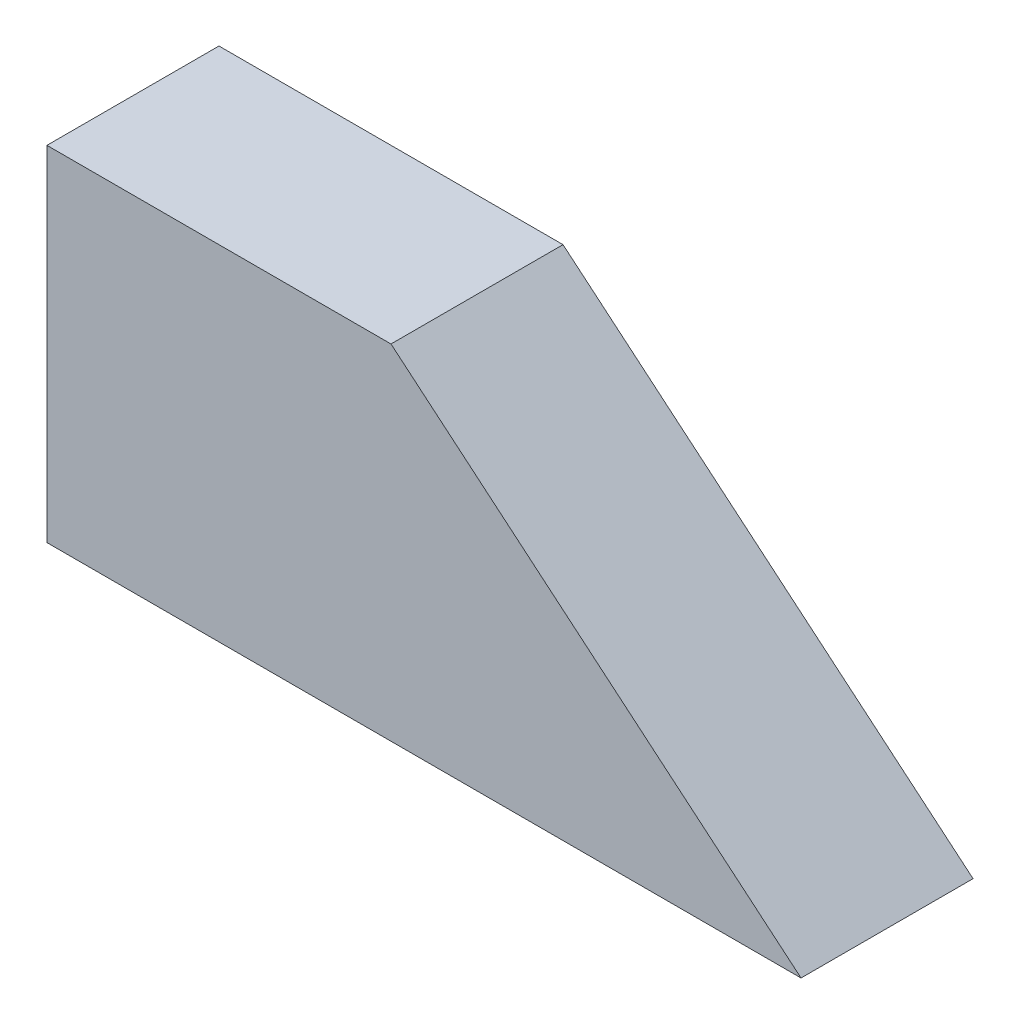
ISO-10303-21;
HEADER;
FILE_DESCRIPTION(('STEP AP214'),'2;1');
FILE_NAME('part.step','',(''),(''),'','','');
FILE_SCHEMA(('AUTOMOTIVE_DESIGN { 1 0 10303 214 1 1 1 1 }'));
ENDSEC;
DATA;
#1=APPLICATION_CONTEXT('core data for automotive mechanical design processes');
#2=APPLICATION_PROTOCOL_DEFINITION('international standard','automotive_design',2000,#1);
#3=PRODUCT_CONTEXT('',#1,'mechanical');
#4=PRODUCT('Part','Part','',(#3));
#5=PRODUCT_RELATED_PRODUCT_CATEGORY('part','',(#4));
#6=PRODUCT_DEFINITION_FORMATION('','',#4);
#7=PRODUCT_DEFINITION_CONTEXT('part definition',#1,'design');
#8=PRODUCT_DEFINITION('design','',#6,#7);
#9=PRODUCT_DEFINITION_SHAPE('','',#8);
#10=(LENGTH_UNIT() NAMED_UNIT(*) SI_UNIT(.MILLI.,.METRE.));
#11=(NAMED_UNIT(*) PLANE_ANGLE_UNIT() SI_UNIT($,.RADIAN.));
#12=(NAMED_UNIT(*) SI_UNIT($,.STERADIAN.) SOLID_ANGLE_UNIT());
#13=UNCERTAINTY_MEASURE_WITH_UNIT(LENGTH_MEASURE(1.E-05),#10,'distance_accuracy_value','');
#14=(GEOMETRIC_REPRESENTATION_CONTEXT(3) GLOBAL_UNCERTAINTY_ASSIGNED_CONTEXT((#13)) GLOBAL_UNIT_ASSIGNED_CONTEXT((#10,
#11,#12)) REPRESENTATION_CONTEXT('',''));
#15=CARTESIAN_POINT('',(0.,0.,0.));
#16=DIRECTION('',(0.,0.,1.));
#17=DIRECTION('',(1.,0.,0.));
#18=AXIS2_PLACEMENT_3D('',#15,#16,#17);
#19=CARTESIAN_POINT('',(0.,0.,500.));
#20=DIRECTION('',(1.,0.,0.));
#21=DIRECTION('',(0.,0.,-1.));
#22=AXIS2_PLACEMENT_3D('',#19,#20,#21);
#23=PLANE('',#22);
#24=DIRECTION('',(0.,-1.,0.));
#25=VECTOR('',#24,1.);
#26=CARTESIAN_POINT('',(0.,0.,0.));
#27=LINE('',#26,#25);
#28=CARTESIAN_POINT('',(0.,1000.,0.));
#29=VERTEX_POINT('',#28);
#30=CARTESIAN_POINT('',(0.,0.,0.));
#31=VERTEX_POINT('',#30);
#32=EDGE_CURVE('E113',#29,#31,#27,.T.);
#33=ORIENTED_EDGE('',*,*,#32,.T.);
#34=DIRECTION('',(0.,0.,-1.));
#35=VECTOR('',#34,1.);
#36=CARTESIAN_POINT('',(0.,0.,500.));
#37=LINE('',#36,#35);
#38=CARTESIAN_POINT('',(0.,0.,500.));
#39=VERTEX_POINT('',#38);
#40=EDGE_CURVE('E11',#39,#31,#37,.T.);
#41=ORIENTED_EDGE('',*,*,#40,.F.);
#42=DIRECTION('',(0.,-1.,0.));
#43=VECTOR('',#42,1.);
#44=CARTESIAN_POINT('',(0.,0.,500.));
#45=LINE('',#44,#43);
#46=CARTESIAN_POINT('',(0.,1000.,500.));
#47=VERTEX_POINT('',#46);
#48=EDGE_CURVE('E97',#47,#39,#45,.T.);
#49=ORIENTED_EDGE('',*,*,#48,.F.);
#50=DIRECTION('',(0.,0.,-1.));
#51=VECTOR('',#50,1.);
#52=CARTESIAN_POINT('',(0.,1000.,500.));
#53=LINE('',#52,#51);
#54=EDGE_CURVE('E109',#47,#29,#53,.T.);
#55=ORIENTED_EDGE('',*,*,#54,.T.);
#56=EDGE_LOOP('',(#33,#41,#49,#55));
#57=FACE_BOUND('',#56,.T.);
#58=ADVANCED_FACE('F45',(#57),#23,.F.);
#59=CARTESIAN_POINT('',(2191.75359259421,1.03466405564457E-13,500.));
#60=DIRECTION('',(0.,1.,0.));
#61=DIRECTION('',(-1.,0.,0.));
#62=AXIS2_PLACEMENT_3D('',#59,#60,#61);
#63=PLANE('',#62);
#64=DIRECTION('',(1.,0.,0.));
#65=VECTOR('',#64,1.);
#66=CARTESIAN_POINT('',(2191.75359259421,1.03466405564457E-13,0.));
#67=LINE('',#66,#65);
#68=CARTESIAN_POINT('',(2191.75359259421,1.03466405564457E-13,0.));
#69=VERTEX_POINT('',#68);
#70=EDGE_CURVE('E102',#31,#69,#67,.T.);
#71=ORIENTED_EDGE('',*,*,#70,.T.);
#72=DIRECTION('',(0.,0.,-1.));
#73=VECTOR('',#72,1.);
#74=CARTESIAN_POINT('',(2191.75359259421,1.03466405564457E-13,500.));
#75=LINE('',#74,#73);
#76=CARTESIAN_POINT('',(2191.75359259421,1.03466405564457E-13,500.));
#77=VERTEX_POINT('',#76);
#78=EDGE_CURVE('E54',#77,#69,#75,.T.);
#79=ORIENTED_EDGE('',*,*,#78,.F.);
#80=DIRECTION('',(1.,0.,0.));
#81=VECTOR('',#80,1.);
#82=CARTESIAN_POINT('',(0.,0.,500.));
#83=LINE('',#82,#81);
#84=EDGE_CURVE('E92',#39,#77,#83,.T.);
#85=ORIENTED_EDGE('',*,*,#84,.F.);
#86=ORIENTED_EDGE('',*,*,#40,.T.);
#87=EDGE_LOOP('',(#71,#79,#85,#86));
#88=FACE_BOUND('',#87,.T.);
#89=ADVANCED_FACE('F101',(#88),#63,.F.);
#90=CARTESIAN_POINT('',(1000.,1000.,500.));
#91=DIRECTION('',(-0.64278760968654,-0.766044443118977,0.));
#92=DIRECTION('',(0.766044443118977,-0.64278760968654,0.));
#93=AXIS2_PLACEMENT_3D('',#90,#91,#92);
#94=PLANE('',#93);
#95=DIRECTION('',(-0.766044443118977,0.64278760968654,0.));
#96=VECTOR('',#95,1.);
#97=CARTESIAN_POINT('',(1000.,1000.,0.));
#98=LINE('',#97,#96);
#99=CARTESIAN_POINT('',(1000.,1000.,0.));
#100=VERTEX_POINT('',#99);
#101=EDGE_CURVE('E79',#69,#100,#98,.T.);
#102=ORIENTED_EDGE('',*,*,#101,.T.);
#103=DIRECTION('',(0.,0.,-1.));
#104=VECTOR('',#103,1.);
#105=CARTESIAN_POINT('',(1000.,1000.,500.));
#106=LINE('',#105,#104);
#107=CARTESIAN_POINT('',(1000.,1000.,500.));
#108=VERTEX_POINT('',#107);
#109=EDGE_CURVE('E104',#108,#100,#106,.T.);
#110=ORIENTED_EDGE('',*,*,#109,.F.);
#111=DIRECTION('',(-0.766044443118977,0.64278760968654,0.));
#112=VECTOR('',#111,1.);
#113=CARTESIAN_POINT('',(1000.,1000.,500.));
#114=LINE('',#113,#112);
#115=EDGE_CURVE('E95',#77,#108,#114,.T.);
#116=ORIENTED_EDGE('',*,*,#115,.F.);
#117=ORIENTED_EDGE('',*,*,#78,.T.);
#118=EDGE_LOOP('',(#102,#110,#116,#117));
#119=FACE_BOUND('',#118,.T.);
#120=ADVANCED_FACE('F105',(#119),#94,.F.);
#121=CARTESIAN_POINT('',(0.,1000.,500.));
#122=DIRECTION('',(0.,-1.,0.));
#123=DIRECTION('',(0.,0.,-1.));
#124=AXIS2_PLACEMENT_3D('',#121,#122,#123);
#125=PLANE('',#124);
#126=DIRECTION('',(-1.,0.,0.));
#127=VECTOR('',#126,1.);
#128=CARTESIAN_POINT('',(0.,1000.,0.));
#129=LINE('',#128,#127);
#130=EDGE_CURVE('E85',#100,#29,#129,.T.);
#131=ORIENTED_EDGE('',*,*,#130,.T.);
#132=ORIENTED_EDGE('',*,*,#54,.F.);
#133=DIRECTION('',(-1.,0.,0.));
#134=VECTOR('',#133,1.);
#135=CARTESIAN_POINT('',(0.,1000.,500.));
#136=LINE('',#135,#134);
#137=EDGE_CURVE('E62',#108,#47,#136,.T.);
#138=ORIENTED_EDGE('',*,*,#137,.F.);
#139=ORIENTED_EDGE('',*,*,#109,.T.);
#140=EDGE_LOOP('',(#131,#132,#138,#139));
#141=FACE_BOUND('',#140,.T.);
#142=ADVANCED_FACE('F126',(#141),#125,.F.);
#143=CARTESIAN_POINT('',(0.,0.,500.));
#144=DIRECTION('',(0.,0.,-1.));
#145=DIRECTION('',(-1.,0.,0.));
#146=AXIS2_PLACEMENT_3D('',#143,#144,#145);
#147=PLANE('',#146);
#148=ORIENTED_EDGE('',*,*,#48,.T.);
#149=ORIENTED_EDGE('',*,*,#84,.T.);
#150=ORIENTED_EDGE('',*,*,#115,.T.);
#151=ORIENTED_EDGE('',*,*,#137,.T.);
#152=EDGE_LOOP('',(#148,#149,#150,#151));
#153=FACE_BOUND('',#152,.T.);
#154=ADVANCED_FACE('F93',(#153),#147,.F.);
#155=CARTESIAN_POINT('',(0.,0.,0.));
#156=DIRECTION('',(0.,0.,-1.));
#157=DIRECTION('',(-1.,0.,0.));
#158=AXIS2_PLACEMENT_3D('',#155,#156,#157);
#159=PLANE('',#158);
#160=ORIENTED_EDGE('',*,*,#32,.F.);
#161=ORIENTED_EDGE('',*,*,#130,.F.);
#162=ORIENTED_EDGE('',*,*,#101,.F.);
#163=ORIENTED_EDGE('',*,*,#70,.F.);
#164=EDGE_LOOP('',(#160,#161,#162,#163));
#165=FACE_BOUND('',#164,.T.);
#166=ADVANCED_FACE('F129',(#165),#159,.T.);
#167=CLOSED_SHELL('',(#58,#89,#120,#142,#154,#166));
#168=MANIFOLD_SOLID_BREP('B2',#167);
#169=ADVANCED_BREP_SHAPE_REPRESENTATION('',(#18,#168),#14);
#170=SHAPE_DEFINITION_REPRESENTATION(#9,#169);
ENDSEC;
END-ISO-10303-21;
